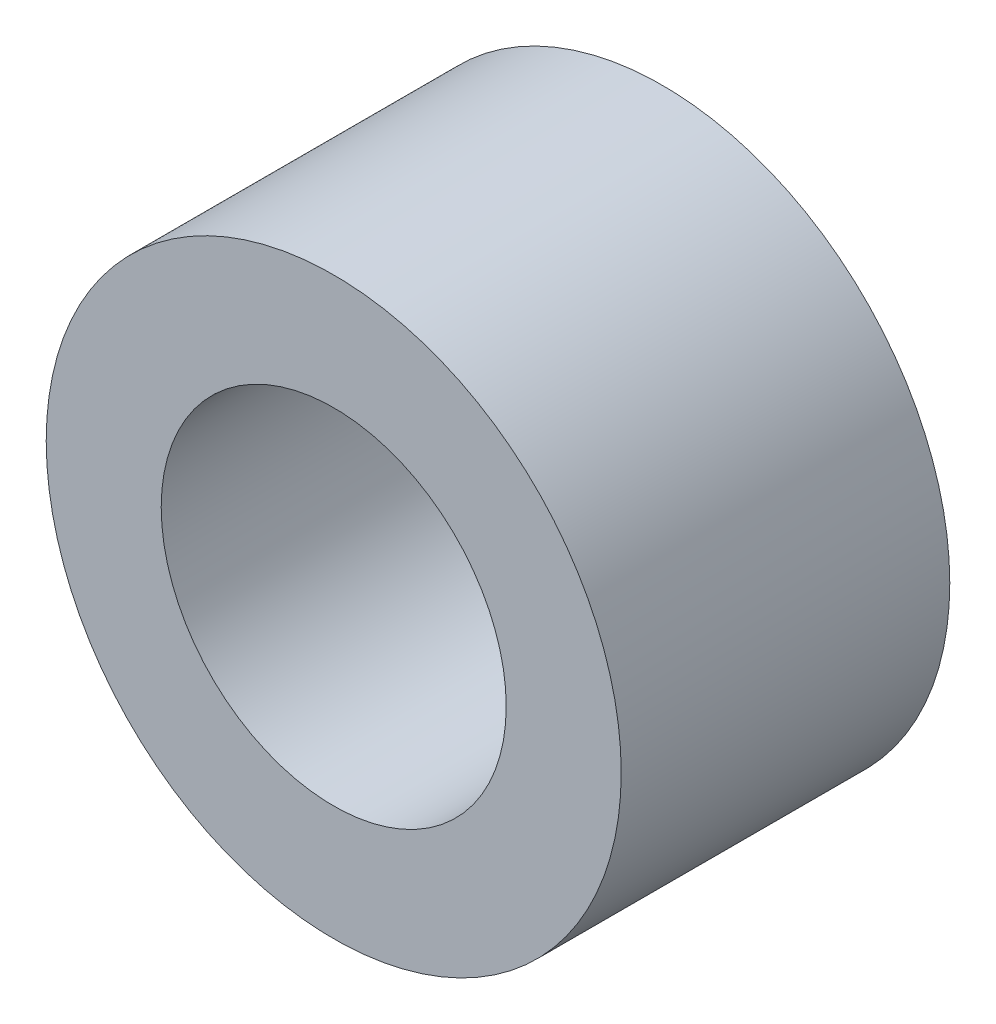
ISO-10303-21;
HEADER;
FILE_DESCRIPTION(('STEP AP214'),'2;1');
FILE_NAME('part.step','',(''),(''),'','','');
FILE_SCHEMA(('AUTOMOTIVE_DESIGN { 1 0 10303 214 1 1 1 1 }'));
ENDSEC;
DATA;
#1=APPLICATION_CONTEXT('core data for automotive mechanical design processes');
#2=APPLICATION_PROTOCOL_DEFINITION('international standard','automotive_design',2000,#1);
#3=PRODUCT_CONTEXT('',#1,'mechanical');
#4=PRODUCT('Part','Part','',(#3));
#5=PRODUCT_RELATED_PRODUCT_CATEGORY('part','',(#4));
#6=PRODUCT_DEFINITION_FORMATION('','',#4);
#7=PRODUCT_DEFINITION_CONTEXT('part definition',#1,'design');
#8=PRODUCT_DEFINITION('design','',#6,#7);
#9=PRODUCT_DEFINITION_SHAPE('','',#8);
#10=(LENGTH_UNIT() NAMED_UNIT(*) SI_UNIT(.MILLI.,.METRE.));
#11=(NAMED_UNIT(*) PLANE_ANGLE_UNIT() SI_UNIT($,.RADIAN.));
#12=(NAMED_UNIT(*) SI_UNIT($,.STERADIAN.) SOLID_ANGLE_UNIT());
#13=UNCERTAINTY_MEASURE_WITH_UNIT(LENGTH_MEASURE(1.E-05),#10,'distance_accuracy_value','');
#14=(GEOMETRIC_REPRESENTATION_CONTEXT(3) GLOBAL_UNCERTAINTY_ASSIGNED_CONTEXT((#13)) GLOBAL_UNIT_ASSIGNED_CONTEXT((#10,
#11,#12)) REPRESENTATION_CONTEXT('',''));
#15=CARTESIAN_POINT('',(0.,0.,0.));
#16=DIRECTION('',(0.,0.,1.));
#17=DIRECTION('',(1.,0.,0.));
#18=AXIS2_PLACEMENT_3D('',#15,#16,#17);
#19=CARTESIAN_POINT('',(0.,0.,4.));
#20=DIRECTION('',(0.,0.,1.));
#21=DIRECTION('',(1.,0.,0.));
#22=AXIS2_PLACEMENT_3D('',#19,#20,#21);
#23=PLANE('',#22);
#24=CARTESIAN_POINT('',(0.,0.,4.));
#25=DIRECTION('',(0.,0.,1.));
#26=DIRECTION('',(1.,0.,0.));
#27=AXIS2_PLACEMENT_3D('',#24,#25,#26);
#28=CIRCLE('',#27,3.5);
#29=CARTESIAN_POINT('',(3.5,0.,4.));
#30=VERTEX_POINT('',#29);
#31=EDGE_CURVE('E10',#30,#30,#28,.T.);
#32=ORIENTED_EDGE('',*,*,#31,.T.);
#33=EDGE_LOOP('',(#32));
#34=FACE_BOUND('',#33,.T.);
#35=CARTESIAN_POINT('',(0.,0.,4.));
#36=DIRECTION('',(0.,0.,1.));
#37=DIRECTION('',(1.,0.,0.));
#38=AXIS2_PLACEMENT_3D('',#35,#36,#37);
#39=CIRCLE('',#38,2.1);
#40=CARTESIAN_POINT('',(2.1,0.,4.));
#41=VERTEX_POINT('',#40);
#42=EDGE_CURVE('E50',#41,#41,#39,.T.);
#43=ORIENTED_EDGE('',*,*,#42,.F.);
#44=EDGE_LOOP('',(#43));
#45=FACE_BOUND('',#44,.T.);
#46=ADVANCED_FACE('F37',(#34,#45),#23,.T.);
#47=CARTESIAN_POINT('',(0.,0.,0.));
#48=DIRECTION('',(0.,0.,1.));
#49=DIRECTION('',(1.,0.,0.));
#50=AXIS2_PLACEMENT_3D('',#47,#48,#49);
#51=PLANE('',#50);
#52=CARTESIAN_POINT('',(0.,0.,0.));
#53=DIRECTION('',(0.,0.,1.));
#54=DIRECTION('',(1.,0.,0.));
#55=AXIS2_PLACEMENT_3D('',#52,#53,#54);
#56=CIRCLE('',#55,3.5);
#57=CARTESIAN_POINT('',(3.5,0.,0.));
#58=VERTEX_POINT('',#57);
#59=EDGE_CURVE('E41',#58,#58,#56,.T.);
#60=ORIENTED_EDGE('',*,*,#59,.F.);
#61=EDGE_LOOP('',(#60));
#62=FACE_BOUND('',#61,.T.);
#63=CARTESIAN_POINT('',(0.,0.,0.));
#64=DIRECTION('',(0.,0.,1.));
#65=DIRECTION('',(1.,0.,0.));
#66=AXIS2_PLACEMENT_3D('',#63,#64,#65);
#67=CIRCLE('',#66,2.1);
#68=CARTESIAN_POINT('',(2.1,0.,0.));
#69=VERTEX_POINT('',#68);
#70=EDGE_CURVE('E52',#69,#69,#67,.T.);
#71=ORIENTED_EDGE('',*,*,#70,.T.);
#72=EDGE_LOOP('',(#71));
#73=FACE_BOUND('',#72,.T.);
#74=ADVANCED_FACE('F64',(#62,#73),#51,.F.);
#75=CARTESIAN_POINT('',(0.,0.,4.));
#76=DIRECTION('',(0.,0.,-1.));
#77=DIRECTION('',(-1.,0.,0.));
#78=AXIS2_PLACEMENT_3D('',#75,#76,#77);
#79=CYLINDRICAL_SURFACE('',#78,3.5);
#80=ORIENTED_EDGE('',*,*,#31,.F.);
#81=EDGE_LOOP('',(#80));
#82=FACE_BOUND('',#81,.T.);
#83=ORIENTED_EDGE('',*,*,#59,.T.);
#84=EDGE_LOOP('',(#83));
#85=FACE_BOUND('',#84,.T.);
#86=ADVANCED_FACE('F39',(#82,#85),#79,.T.);
#87=CARTESIAN_POINT('',(0.,0.,4.));
#88=DIRECTION('',(0.,0.,-1.));
#89=DIRECTION('',(-1.,0.,0.));
#90=AXIS2_PLACEMENT_3D('',#87,#88,#89);
#91=CYLINDRICAL_SURFACE('',#90,2.1);
#92=ORIENTED_EDGE('',*,*,#42,.T.);
#93=EDGE_LOOP('',(#92));
#94=FACE_BOUND('',#93,.T.);
#95=ORIENTED_EDGE('',*,*,#70,.F.);
#96=EDGE_LOOP('',(#95));
#97=FACE_BOUND('',#96,.T.);
#98=ADVANCED_FACE('F60',(#94,#97),#91,.F.);
#99=CLOSED_SHELL('',(#46,#74,#86,#98));
#100=MANIFOLD_SOLID_BREP('B2',#99);
#101=ADVANCED_BREP_SHAPE_REPRESENTATION('',(#18,#100),#14);
#102=SHAPE_DEFINITION_REPRESENTATION(#9,#101);
ENDSEC;
END-ISO-10303-21;
